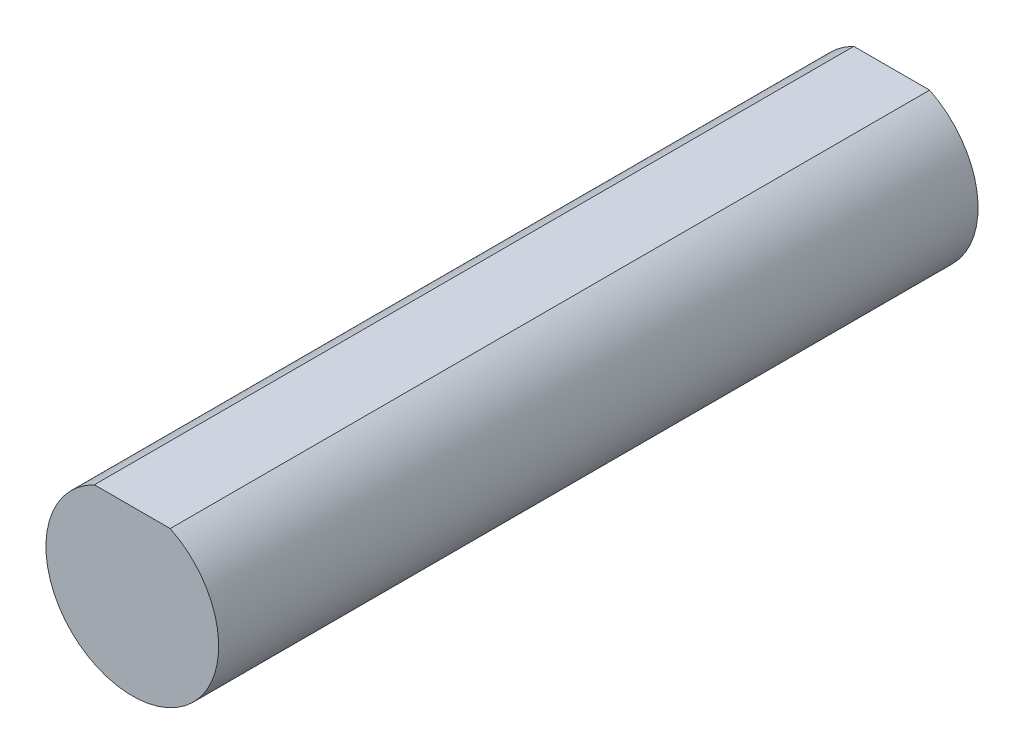
ISO-10303-21;
HEADER;
FILE_DESCRIPTION(('STEP AP214'),'2;1');
FILE_NAME('part.step','',(''),(''),'','','');
FILE_SCHEMA(('AUTOMOTIVE_DESIGN { 1 0 10303 214 1 1 1 1 }'));
ENDSEC;
DATA;
#1=APPLICATION_CONTEXT('core data for automotive mechanical design processes');
#2=APPLICATION_PROTOCOL_DEFINITION('international standard','automotive_design',2000,#1);
#3=PRODUCT_CONTEXT('',#1,'mechanical');
#4=PRODUCT('Part','Part','',(#3));
#5=PRODUCT_RELATED_PRODUCT_CATEGORY('part','',(#4));
#6=PRODUCT_DEFINITION_FORMATION('','',#4);
#7=PRODUCT_DEFINITION_CONTEXT('part definition',#1,'design');
#8=PRODUCT_DEFINITION('design','',#6,#7);
#9=PRODUCT_DEFINITION_SHAPE('','',#8);
#10=(LENGTH_UNIT() NAMED_UNIT(*) SI_UNIT(.MILLI.,.METRE.));
#11=(NAMED_UNIT(*) PLANE_ANGLE_UNIT() SI_UNIT($,.RADIAN.));
#12=(NAMED_UNIT(*) SI_UNIT($,.STERADIAN.) SOLID_ANGLE_UNIT());
#13=UNCERTAINTY_MEASURE_WITH_UNIT(LENGTH_MEASURE(1.E-05),#10,'distance_accuracy_value','');
#14=(GEOMETRIC_REPRESENTATION_CONTEXT(3) GLOBAL_UNCERTAINTY_ASSIGNED_CONTEXT((#13)) GLOBAL_UNIT_ASSIGNED_CONTEXT((#10,
#11,#12)) REPRESENTATION_CONTEXT('',''));
#15=CARTESIAN_POINT('',(0.,0.,0.));
#16=DIRECTION('',(0.,0.,1.));
#17=DIRECTION('',(1.,0.,0.));
#18=AXIS2_PLACEMENT_3D('',#15,#16,#17);
#19=CARTESIAN_POINT('',(0.,0.,21.9964));
#20=DIRECTION('',(0.,0.,-1.));
#21=DIRECTION('',(-1.,0.,0.));
#22=AXIS2_PLACEMENT_3D('',#19,#20,#21);
#23=CYLINDRICAL_SURFACE('',#22,2.5019);
#24=CARTESIAN_POINT('',(0.,0.,21.9964));
#25=DIRECTION('',(0.,0.,1.));
#26=DIRECTION('',(1.,0.,0.));
#27=AXIS2_PLACEMENT_3D('',#24,#25,#26);
#28=CIRCLE('',#27,2.5019);
#29=CARTESIAN_POINT('',(-1.09838481417034,2.2479,21.9964));
#30=VERTEX_POINT('',#29);
#31=CARTESIAN_POINT('',(1.09838481417034,2.2479,21.9964));
#32=VERTEX_POINT('',#31);
#33=EDGE_CURVE('E11',#30,#32,#28,.T.);
#34=ORIENTED_EDGE('',*,*,#33,.F.);
#35=DIRECTION('',(0.,0.,1.));
#36=VECTOR('',#35,1.);
#37=CARTESIAN_POINT('',(-1.09838481417034,2.2479,0.));
#38=LINE('',#37,#36);
#39=CARTESIAN_POINT('',(-1.09838481417034,2.2479,0.));
#40=VERTEX_POINT('',#39);
#41=EDGE_CURVE('E62',#40,#30,#38,.T.);
#42=ORIENTED_EDGE('',*,*,#41,.F.);
#43=CARTESIAN_POINT('',(0.,0.,0.));
#44=DIRECTION('',(0.,0.,1.));
#45=DIRECTION('',(1.,0.,0.));
#46=AXIS2_PLACEMENT_3D('',#43,#44,#45);
#47=CIRCLE('',#46,2.5019);
#48=CARTESIAN_POINT('',(1.09838481417034,2.2479,0.));
#49=VERTEX_POINT('',#48);
#50=EDGE_CURVE('E42',#40,#49,#47,.T.);
#51=ORIENTED_EDGE('',*,*,#50,.T.);
#52=DIRECTION('',(0.,0.,1.));
#53=VECTOR('',#52,1.);
#54=CARTESIAN_POINT('',(1.09838481417034,2.2479,0.));
#55=LINE('',#54,#53);
#56=EDGE_CURVE('E53',#49,#32,#55,.T.);
#57=ORIENTED_EDGE('',*,*,#56,.T.);
#58=EDGE_LOOP('',(#34,#42,#51,#57));
#59=FACE_BOUND('',#58,.T.);
#60=ADVANCED_FACE('F39',(#59),#23,.T.);
#61=CARTESIAN_POINT('',(0.,0.,21.9964));
#62=DIRECTION('',(0.,0.,1.));
#63=DIRECTION('',(1.,0.,0.));
#64=AXIS2_PLACEMENT_3D('',#61,#62,#63);
#65=PLANE('',#64);
#66=DIRECTION('',(1.,0.,0.));
#67=VECTOR('',#66,1.);
#68=CARTESIAN_POINT('',(-1.09838481417034,2.2479,21.9964));
#69=LINE('',#68,#67);
#70=EDGE_CURVE('E65',#30,#32,#69,.T.);
#71=ORIENTED_EDGE('',*,*,#70,.F.);
#72=ORIENTED_EDGE('',*,*,#33,.T.);
#73=EDGE_LOOP('',(#71,#72));
#74=FACE_BOUND('',#73,.T.);
#75=ADVANCED_FACE('F72',(#74),#65,.T.);
#76=CARTESIAN_POINT('',(0.,0.,0.));
#77=DIRECTION('',(0.,0.,1.));
#78=DIRECTION('',(1.,0.,0.));
#79=AXIS2_PLACEMENT_3D('',#76,#77,#78);
#80=PLANE('',#79);
#81=ORIENTED_EDGE('',*,*,#50,.F.);
#82=DIRECTION('',(1.,0.,0.));
#83=VECTOR('',#82,1.);
#84=CARTESIAN_POINT('',(-1.09838481417034,2.2479,0.));
#85=LINE('',#84,#83);
#86=EDGE_CURVE('E58',#40,#49,#85,.T.);
#87=ORIENTED_EDGE('',*,*,#86,.T.);
#88=EDGE_LOOP('',(#81,#87));
#89=FACE_BOUND('',#88,.T.);
#90=ADVANCED_FACE('F77',(#89),#80,.F.);
#91=CARTESIAN_POINT('',(-1.09838481417034,2.2479,0.));
#92=DIRECTION('',(0.,-1.,0.));
#93=DIRECTION('',(0.,0.,-1.));
#94=AXIS2_PLACEMENT_3D('',#91,#92,#93);
#95=PLANE('',#94);
#96=ORIENTED_EDGE('',*,*,#70,.T.);
#97=ORIENTED_EDGE('',*,*,#56,.F.);
#98=ORIENTED_EDGE('',*,*,#86,.F.);
#99=ORIENTED_EDGE('',*,*,#41,.T.);
#100=EDGE_LOOP('',(#96,#97,#98,#99));
#101=FACE_BOUND('',#100,.T.);
#102=ADVANCED_FACE('F64',(#101),#95,.F.);
#103=CLOSED_SHELL('',(#60,#75,#90,#102));
#104=MANIFOLD_SOLID_BREP('B2',#103);
#105=ADVANCED_BREP_SHAPE_REPRESENTATION('',(#18,#104),#14);
#106=SHAPE_DEFINITION_REPRESENTATION(#9,#105);
ENDSEC;
END-ISO-10303-21;
